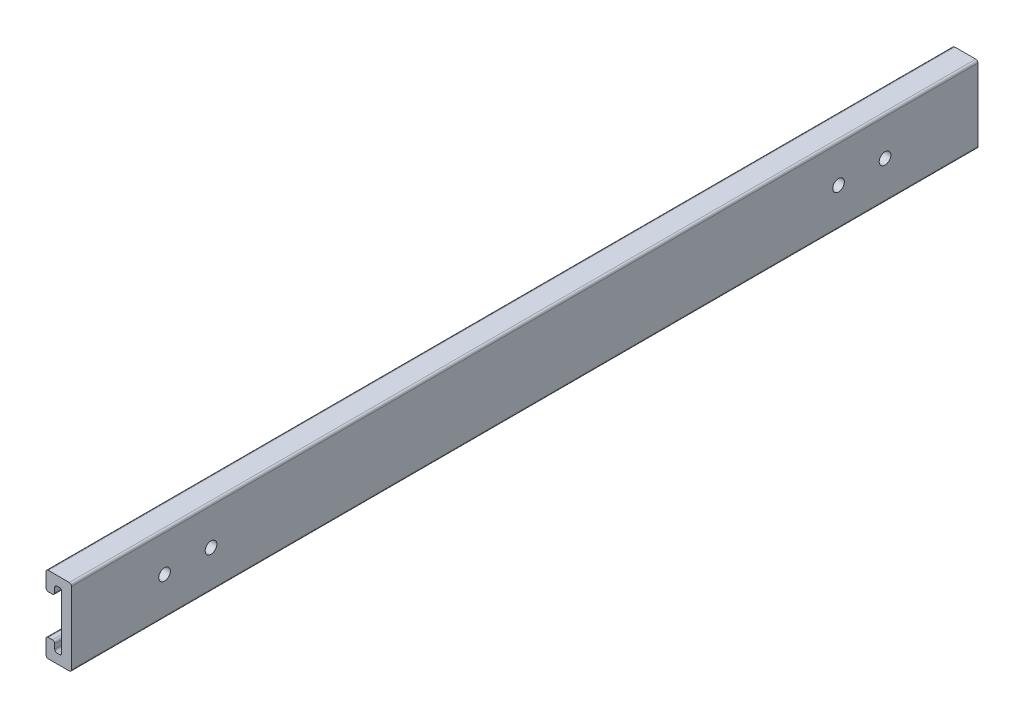
ISO-10303-21;
HEADER;
FILE_DESCRIPTION(('STEP AP214'),'2;1');
FILE_NAME('part.step','',(''),(''),'','','');
FILE_SCHEMA(('AUTOMOTIVE_DESIGN { 1 0 10303 214 1 1 1 1 }'));
ENDSEC;
DATA;
#1=APPLICATION_CONTEXT('core data for automotive mechanical design processes');
#2=APPLICATION_PROTOCOL_DEFINITION('international standard','automotive_design',2000,#1);
#3=PRODUCT_CONTEXT('',#1,'mechanical');
#4=PRODUCT('Part','Part','',(#3));
#5=PRODUCT_RELATED_PRODUCT_CATEGORY('part','',(#4));
#6=PRODUCT_DEFINITION_FORMATION('','',#4);
#7=PRODUCT_DEFINITION_CONTEXT('part definition',#1,'design');
#8=PRODUCT_DEFINITION('design','',#6,#7);
#9=PRODUCT_DEFINITION_SHAPE('','',#8);
#10=(LENGTH_UNIT() NAMED_UNIT(*) SI_UNIT(.MILLI.,.METRE.));
#11=(NAMED_UNIT(*) PLANE_ANGLE_UNIT() SI_UNIT($,.RADIAN.));
#12=(NAMED_UNIT(*) SI_UNIT($,.STERADIAN.) SOLID_ANGLE_UNIT());
#13=UNCERTAINTY_MEASURE_WITH_UNIT(LENGTH_MEASURE(1.E-05),#10,'distance_accuracy_value','');
#14=(GEOMETRIC_REPRESENTATION_CONTEXT(3) GLOBAL_UNCERTAINTY_ASSIGNED_CONTEXT((#13)) GLOBAL_UNIT_ASSIGNED_CONTEXT((#10,
#11,#12)) REPRESENTATION_CONTEXT('',''));
#15=CARTESIAN_POINT('',(0.,0.,0.));
#16=DIRECTION('',(0.,0.,1.));
#17=DIRECTION('',(1.,0.,0.));
#18=AXIS2_PLACEMENT_3D('',#15,#16,#17);
#19=CARTESIAN_POINT('',(4.5,15.5,195.));
#20=DIRECTION('',(0.,0.,-1.));
#21=DIRECTION('',(-1.,0.,0.));
#22=AXIS2_PLACEMENT_3D('',#19,#20,#21);
#23=CYLINDRICAL_SURFACE('',#22,1.);
#24=CARTESIAN_POINT('',(4.5,15.5,-195.));
#25=DIRECTION('',(0.,0.,1.));
#26=DIRECTION('',(1.,0.,0.));
#27=AXIS2_PLACEMENT_3D('',#24,#25,#26);
#28=CIRCLE('',#27,1.);
#29=CARTESIAN_POINT('',(5.5,15.5,-195.));
#30=VERTEX_POINT('',#29);
#31=CARTESIAN_POINT('',(4.49999999999999,16.5,-195.));
#32=VERTEX_POINT('',#31);
#33=EDGE_CURVE('E226',#30,#32,#28,.T.);
#34=ORIENTED_EDGE('',*,*,#33,.T.);
#35=DIRECTION('',(0.,0.,-1.));
#36=VECTOR('',#35,1.);
#37=CARTESIAN_POINT('',(4.49999999999999,16.5,195.));
#38=LINE('',#37,#36);
#39=CARTESIAN_POINT('',(4.49999999999999,16.5,195.));
#40=VERTEX_POINT('',#39);
#41=EDGE_CURVE('E11',#40,#32,#38,.T.);
#42=ORIENTED_EDGE('',*,*,#41,.F.);
#43=CARTESIAN_POINT('',(4.5,15.5,195.));
#44=DIRECTION('',(0.,0.,1.));
#45=DIRECTION('',(1.,0.,0.));
#46=AXIS2_PLACEMENT_3D('',#43,#44,#45);
#47=CIRCLE('',#46,1.);
#48=CARTESIAN_POINT('',(5.5,15.5,195.));
#49=VERTEX_POINT('',#48);
#50=EDGE_CURVE('E273',#49,#40,#47,.T.);
#51=ORIENTED_EDGE('',*,*,#50,.F.);
#52=DIRECTION('',(0.,0.,-1.));
#53=VECTOR('',#52,1.);
#54=CARTESIAN_POINT('',(5.5,15.5,195.));
#55=LINE('',#54,#53);
#56=EDGE_CURVE('E222',#49,#30,#55,.T.);
#57=ORIENTED_EDGE('',*,*,#56,.T.);
#58=EDGE_LOOP('',(#34,#42,#51,#57));
#59=FACE_BOUND('',#58,.T.);
#60=ADVANCED_FACE('F34',(#59),#23,.T.);
#61=CARTESIAN_POINT('',(4.49999999999999,16.5,195.));
#62=DIRECTION('',(0.,-1.,0.));
#63=DIRECTION('',(1.,0.,0.));
#64=AXIS2_PLACEMENT_3D('',#61,#62,#63);
#65=PLANE('',#64);
#66=DIRECTION('',(-1.,0.,0.));
#67=VECTOR('',#66,1.);
#68=CARTESIAN_POINT('',(4.49999999999999,16.5,-195.));
#69=LINE('',#68,#67);
#70=CARTESIAN_POINT('',(-4.49999999999999,16.5,-195.));
#71=VERTEX_POINT('',#70);
#72=EDGE_CURVE('E229',#32,#71,#69,.T.);
#73=ORIENTED_EDGE('',*,*,#72,.T.);
#74=DIRECTION('',(0.,0.,-1.));
#75=VECTOR('',#74,1.);
#76=CARTESIAN_POINT('',(-4.49999999999999,16.5,195.));
#77=LINE('',#76,#75);
#78=CARTESIAN_POINT('',(-4.49999999999999,16.5,195.));
#79=VERTEX_POINT('',#78);
#80=EDGE_CURVE('E42',#79,#71,#77,.T.);
#81=ORIENTED_EDGE('',*,*,#80,.F.);
#82=DIRECTION('',(-1.,0.,0.));
#83=VECTOR('',#82,1.);
#84=CARTESIAN_POINT('',(4.49999999999999,16.5,195.));
#85=LINE('',#84,#83);
#86=EDGE_CURVE('E141',#40,#79,#85,.T.);
#87=ORIENTED_EDGE('',*,*,#86,.F.);
#88=ORIENTED_EDGE('',*,*,#41,.T.);
#89=EDGE_LOOP('',(#73,#81,#87,#88));
#90=FACE_BOUND('',#89,.T.);
#91=ADVANCED_FACE('F414',(#90),#65,.F.);
#92=CARTESIAN_POINT('',(-4.5,15.5,195.));
#93=DIRECTION('',(0.,0.,-1.));
#94=DIRECTION('',(-1.,0.,0.));
#95=AXIS2_PLACEMENT_3D('',#92,#93,#94);
#96=CYLINDRICAL_SURFACE('',#95,1.);
#97=CARTESIAN_POINT('',(-4.5,15.5,-195.));
#98=DIRECTION('',(0.,0.,1.));
#99=DIRECTION('',(1.,0.,0.));
#100=AXIS2_PLACEMENT_3D('',#97,#98,#99);
#101=CIRCLE('',#100,1.);
#102=CARTESIAN_POINT('',(-5.5,15.5,-195.));
#103=VERTEX_POINT('',#102);
#104=EDGE_CURVE('E232',#71,#103,#101,.T.);
#105=ORIENTED_EDGE('',*,*,#104,.T.);
#106=DIRECTION('',(0.,0.,-1.));
#107=VECTOR('',#106,1.);
#108=CARTESIAN_POINT('',(-5.5,15.5,195.));
#109=LINE('',#108,#107);
#110=CARTESIAN_POINT('',(-5.5,15.5,195.));
#111=VERTEX_POINT('',#110);
#112=EDGE_CURVE('E328',#111,#103,#109,.T.);
#113=ORIENTED_EDGE('',*,*,#112,.F.);
#114=CARTESIAN_POINT('',(-4.5,15.5,195.));
#115=DIRECTION('',(0.,0.,1.));
#116=DIRECTION('',(1.,0.,0.));
#117=AXIS2_PLACEMENT_3D('',#114,#115,#116);
#118=CIRCLE('',#117,1.);
#119=EDGE_CURVE('E336',#79,#111,#118,.T.);
#120=ORIENTED_EDGE('',*,*,#119,.F.);
#121=ORIENTED_EDGE('',*,*,#80,.T.);
#122=EDGE_LOOP('',(#105,#113,#120,#121));
#123=FACE_BOUND('',#122,.T.);
#124=ADVANCED_FACE('F334',(#123),#96,.T.);
#125=CARTESIAN_POINT('',(-5.5,15.5,195.));
#126=DIRECTION('',(1.,0.,0.));
#127=DIRECTION('',(0.,1.,0.));
#128=AXIS2_PLACEMENT_3D('',#125,#126,#127);
#129=PLANE('',#128);
#130=DIRECTION('',(0.,-1.,0.));
#131=VECTOR('',#130,1.);
#132=CARTESIAN_POINT('',(-5.5,15.5,-195.));
#133=LINE('',#132,#131);
#134=CARTESIAN_POINT('',(-5.5,9.50000000000001,-195.));
#135=VERTEX_POINT('',#134);
#136=EDGE_CURVE('E234',#103,#135,#133,.T.);
#137=ORIENTED_EDGE('',*,*,#136,.T.);
#138=DIRECTION('',(0.,0.,-1.));
#139=VECTOR('',#138,1.);
#140=CARTESIAN_POINT('',(-5.5,9.50000000000001,195.));
#141=LINE('',#140,#139);
#142=CARTESIAN_POINT('',(-5.5,9.50000000000001,195.));
#143=VERTEX_POINT('',#142);
#144=EDGE_CURVE('E325',#143,#135,#141,.T.);
#145=ORIENTED_EDGE('',*,*,#144,.F.);
#146=DIRECTION('',(0.,-1.,0.));
#147=VECTOR('',#146,1.);
#148=CARTESIAN_POINT('',(-5.5,15.5,195.));
#149=LINE('',#148,#147);
#150=EDGE_CURVE('E354',#111,#143,#149,.T.);
#151=ORIENTED_EDGE('',*,*,#150,.F.);
#152=ORIENTED_EDGE('',*,*,#112,.T.);
#153=EDGE_LOOP('',(#137,#145,#151,#152));
#154=FACE_BOUND('',#153,.T.);
#155=ADVANCED_FACE('F345',(#154),#129,.F.);
#156=CARTESIAN_POINT('',(-4.5,9.5,195.));
#157=DIRECTION('',(0.,0.,-1.));
#158=DIRECTION('',(-1.,0.,0.));
#159=AXIS2_PLACEMENT_3D('',#156,#157,#158);
#160=CYLINDRICAL_SURFACE('',#159,1.);
#161=CARTESIAN_POINT('',(-4.5,9.5,-195.));
#162=DIRECTION('',(0.,0.,1.));
#163=DIRECTION('',(1.,0.,0.));
#164=AXIS2_PLACEMENT_3D('',#161,#162,#163);
#165=CIRCLE('',#164,1.);
#166=CARTESIAN_POINT('',(-4.49999999999999,8.5,-195.));
#167=VERTEX_POINT('',#166);
#168=EDGE_CURVE('E236',#135,#167,#165,.T.);
#169=ORIENTED_EDGE('',*,*,#168,.T.);
#170=DIRECTION('',(0.,0.,-1.));
#171=VECTOR('',#170,1.);
#172=CARTESIAN_POINT('',(-4.49999999999999,8.5,195.));
#173=LINE('',#172,#171);
#174=CARTESIAN_POINT('',(-4.49999999999999,8.5,195.));
#175=VERTEX_POINT('',#174);
#176=EDGE_CURVE('E322',#175,#167,#173,.T.);
#177=ORIENTED_EDGE('',*,*,#176,.F.);
#178=CARTESIAN_POINT('',(-4.5,9.5,195.));
#179=DIRECTION('',(0.,0.,1.));
#180=DIRECTION('',(1.,0.,0.));
#181=AXIS2_PLACEMENT_3D('',#178,#179,#180);
#182=CIRCLE('',#181,1.);
#183=EDGE_CURVE('E351',#143,#175,#182,.T.);
#184=ORIENTED_EDGE('',*,*,#183,.F.);
#185=ORIENTED_EDGE('',*,*,#144,.T.);
#186=EDGE_LOOP('',(#169,#177,#184,#185));
#187=FACE_BOUND('',#186,.T.);
#188=ADVANCED_FACE('F349',(#187),#160,.T.);
#189=CARTESIAN_POINT('',(-4.49999999999999,8.5,195.));
#190=DIRECTION('',(0.,1.,0.));
#191=DIRECTION('',(0.,0.,1.));
#192=AXIS2_PLACEMENT_3D('',#189,#190,#191);
#193=PLANE('',#192);
#194=DIRECTION('',(1.,0.,0.));
#195=VECTOR('',#194,1.);
#196=CARTESIAN_POINT('',(-4.49999999999999,8.5,-195.));
#197=LINE('',#196,#195);
#198=CARTESIAN_POINT('',(-2.75000000000001,8.5,-195.));
#199=VERTEX_POINT('',#198);
#200=EDGE_CURVE('E238',#167,#199,#197,.T.);
#201=ORIENTED_EDGE('',*,*,#200,.T.);
#202=DIRECTION('',(0.,0.,-1.));
#203=VECTOR('',#202,1.);
#204=CARTESIAN_POINT('',(-2.75000000000001,8.5,195.));
#205=LINE('',#204,#203);
#206=CARTESIAN_POINT('',(-2.75000000000001,8.5,195.));
#207=VERTEX_POINT('',#206);
#208=EDGE_CURVE('E319',#207,#199,#205,.T.);
#209=ORIENTED_EDGE('',*,*,#208,.F.);
#210=DIRECTION('',(1.,0.,0.));
#211=VECTOR('',#210,1.);
#212=CARTESIAN_POINT('',(-4.49999999999999,8.5,195.));
#213=LINE('',#212,#211);
#214=EDGE_CURVE('E353',#175,#207,#213,.T.);
#215=ORIENTED_EDGE('',*,*,#214,.F.);
#216=ORIENTED_EDGE('',*,*,#176,.T.);
#217=EDGE_LOOP('',(#201,#209,#215,#216));
#218=FACE_BOUND('',#217,.T.);
#219=ADVANCED_FACE('F427',(#218),#193,.F.);
#220=CARTESIAN_POINT('',(-2.75,9.5,195.));
#221=DIRECTION('',(0.,0.,-1.));
#222=DIRECTION('',(-1.,0.,0.));
#223=AXIS2_PLACEMENT_3D('',#220,#221,#222);
#224=CYLINDRICAL_SURFACE('',#223,1.);
#225=CARTESIAN_POINT('',(-2.75,9.5,-195.));
#226=DIRECTION('',(0.,0.,1.));
#227=DIRECTION('',(1.,0.,0.));
#228=AXIS2_PLACEMENT_3D('',#225,#226,#227);
#229=CIRCLE('',#228,1.);
#230=CARTESIAN_POINT('',(-1.75,9.50000000000001,-195.));
#231=VERTEX_POINT('',#230);
#232=EDGE_CURVE('E240',#199,#231,#229,.T.);
#233=ORIENTED_EDGE('',*,*,#232,.T.);
#234=DIRECTION('',(0.,0.,-1.));
#235=VECTOR('',#234,1.);
#236=CARTESIAN_POINT('',(-1.75,9.50000000000001,195.));
#237=LINE('',#236,#235);
#238=CARTESIAN_POINT('',(-1.75,9.50000000000001,195.));
#239=VERTEX_POINT('',#238);
#240=EDGE_CURVE('E316',#239,#231,#237,.T.);
#241=ORIENTED_EDGE('',*,*,#240,.F.);
#242=CARTESIAN_POINT('',(-2.75,9.5,195.));
#243=DIRECTION('',(0.,0.,1.));
#244=DIRECTION('',(1.,0.,0.));
#245=AXIS2_PLACEMENT_3D('',#242,#243,#244);
#246=CIRCLE('',#245,1.);
#247=EDGE_CURVE('E356',#207,#239,#246,.T.);
#248=ORIENTED_EDGE('',*,*,#247,.F.);
#249=ORIENTED_EDGE('',*,*,#208,.T.);
#250=EDGE_LOOP('',(#233,#241,#248,#249));
#251=FACE_BOUND('',#250,.T.);
#252=ADVANCED_FACE('F430',(#251),#224,.T.);
#253=CARTESIAN_POINT('',(-1.75,9.50000000000001,195.));
#254=DIRECTION('',(-1.,0.,0.));
#255=DIRECTION('',(0.,0.,1.));
#256=AXIS2_PLACEMENT_3D('',#253,#254,#255);
#257=PLANE('',#256);
#258=DIRECTION('',(0.,1.,0.));
#259=VECTOR('',#258,1.);
#260=CARTESIAN_POINT('',(-1.75,9.50000000000001,-195.));
#261=LINE('',#260,#259);
#262=CARTESIAN_POINT('',(-1.75,11.5,-195.));
#263=VERTEX_POINT('',#262);
#264=EDGE_CURVE('E242',#231,#263,#261,.T.);
#265=ORIENTED_EDGE('',*,*,#264,.T.);
#266=DIRECTION('',(0.,0.,-1.));
#267=VECTOR('',#266,1.);
#268=CARTESIAN_POINT('',(-1.75,11.5,195.));
#269=LINE('',#268,#267);
#270=CARTESIAN_POINT('',(-1.75,11.5,195.));
#271=VERTEX_POINT('',#270);
#272=EDGE_CURVE('E313',#271,#263,#269,.T.);
#273=ORIENTED_EDGE('',*,*,#272,.F.);
#274=DIRECTION('',(0.,1.,0.));
#275=VECTOR('',#274,1.);
#276=CARTESIAN_POINT('',(-1.75,9.50000000000001,195.));
#277=LINE('',#276,#275);
#278=EDGE_CURVE('E362',#239,#271,#277,.T.);
#279=ORIENTED_EDGE('',*,*,#278,.F.);
#280=ORIENTED_EDGE('',*,*,#240,.T.);
#281=EDGE_LOOP('',(#265,#273,#279,#280));
#282=FACE_BOUND('',#281,.T.);
#283=ADVANCED_FACE('F434',(#282),#257,.F.);
#284=CARTESIAN_POINT('',(-0.750000000000001,11.5,195.));
#285=DIRECTION('',(0.,0.,-1.));
#286=DIRECTION('',(-1.,0.,0.));
#287=AXIS2_PLACEMENT_3D('',#284,#285,#286);
#288=CYLINDRICAL_SURFACE('',#287,1.);
#289=CARTESIAN_POINT('',(-0.750000000000001,11.5,-195.));
#290=DIRECTION('',(0.,0.,-1.));
#291=DIRECTION('',(-1.,0.,0.));
#292=AXIS2_PLACEMENT_3D('',#289,#290,#291);
#293=CIRCLE('',#292,1.);
#294=CARTESIAN_POINT('',(-0.749999999999993,12.5,-195.));
#295=VERTEX_POINT('',#294);
#296=EDGE_CURVE('E244',#263,#295,#293,.T.);
#297=ORIENTED_EDGE('',*,*,#296,.T.);
#298=DIRECTION('',(0.,0.,-1.));
#299=VECTOR('',#298,1.);
#300=CARTESIAN_POINT('',(-0.749999999999993,12.5,195.));
#301=LINE('',#300,#299);
#302=CARTESIAN_POINT('',(-0.749999999999993,12.5,195.));
#303=VERTEX_POINT('',#302);
#304=EDGE_CURVE('E310',#303,#295,#301,.T.);
#305=ORIENTED_EDGE('',*,*,#304,.F.);
#306=CARTESIAN_POINT('',(-0.750000000000001,11.5,195.));
#307=DIRECTION('',(0.,0.,-1.));
#308=DIRECTION('',(-1.,0.,0.));
#309=AXIS2_PLACEMENT_3D('',#306,#307,#308);
#310=CIRCLE('',#309,1.);
#311=EDGE_CURVE('E364',#271,#303,#310,.T.);
#312=ORIENTED_EDGE('',*,*,#311,.F.);
#313=ORIENTED_EDGE('',*,*,#272,.T.);
#314=EDGE_LOOP('',(#297,#305,#312,#313));
#315=FACE_BOUND('',#314,.T.);
#316=ADVANCED_FACE('F438',(#315),#288,.F.);
#317=CARTESIAN_POINT('',(-0.749999999999993,12.5,195.));
#318=DIRECTION('',(0.,1.,0.));
#319=DIRECTION('',(0.,0.,1.));
#320=AXIS2_PLACEMENT_3D('',#317,#318,#319);
#321=PLANE('',#320);
#322=DIRECTION('',(1.,0.,0.));
#323=VECTOR('',#322,1.);
#324=CARTESIAN_POINT('',(-0.749999999999993,12.5,-195.));
#325=LINE('',#324,#323);
#326=CARTESIAN_POINT('',(0.249999999999993,12.5,-195.));
#327=VERTEX_POINT('',#326);
#328=EDGE_CURVE('E246',#295,#327,#325,.T.);
#329=ORIENTED_EDGE('',*,*,#328,.T.);
#330=DIRECTION('',(0.,0.,-1.));
#331=VECTOR('',#330,1.);
#332=CARTESIAN_POINT('',(0.249999999999993,12.5,195.));
#333=LINE('',#332,#331);
#334=CARTESIAN_POINT('',(0.249999999999993,12.5,195.));
#335=VERTEX_POINT('',#334);
#336=EDGE_CURVE('E307',#335,#327,#333,.T.);
#337=ORIENTED_EDGE('',*,*,#336,.F.);
#338=DIRECTION('',(1.,0.,0.));
#339=VECTOR('',#338,1.);
#340=CARTESIAN_POINT('',(-0.749999999999993,12.5,195.));
#341=LINE('',#340,#339);
#342=EDGE_CURVE('E366',#303,#335,#341,.T.);
#343=ORIENTED_EDGE('',*,*,#342,.F.);
#344=ORIENTED_EDGE('',*,*,#304,.T.);
#345=EDGE_LOOP('',(#329,#337,#343,#344));
#346=FACE_BOUND('',#345,.T.);
#347=ADVANCED_FACE('F442',(#346),#321,.F.);
#348=CARTESIAN_POINT('',(0.249999999999999,11.5,195.));
#349=DIRECTION('',(0.,0.,-1.));
#350=DIRECTION('',(-1.,0.,0.));
#351=AXIS2_PLACEMENT_3D('',#348,#349,#350);
#352=CYLINDRICAL_SURFACE('',#351,1.);
#353=CARTESIAN_POINT('',(0.249999999999999,11.5,-195.));
#354=DIRECTION('',(0.,0.,-1.));
#355=DIRECTION('',(-1.,0.,0.));
#356=AXIS2_PLACEMENT_3D('',#353,#354,#355);
#357=CIRCLE('',#356,1.);
#358=CARTESIAN_POINT('',(1.25,11.5,-195.));
#359=VERTEX_POINT('',#358);
#360=EDGE_CURVE('E248',#327,#359,#357,.T.);
#361=ORIENTED_EDGE('',*,*,#360,.T.);
#362=DIRECTION('',(0.,0.,-1.));
#363=VECTOR('',#362,1.);
#364=CARTESIAN_POINT('',(1.25,11.5,195.));
#365=LINE('',#364,#363);
#366=CARTESIAN_POINT('',(1.25,11.5,195.));
#367=VERTEX_POINT('',#366);
#368=EDGE_CURVE('E304',#367,#359,#365,.T.);
#369=ORIENTED_EDGE('',*,*,#368,.F.);
#370=CARTESIAN_POINT('',(0.249999999999999,11.5,195.));
#371=DIRECTION('',(0.,0.,-1.));
#372=DIRECTION('',(-1.,0.,0.));
#373=AXIS2_PLACEMENT_3D('',#370,#371,#372);
#374=CIRCLE('',#373,1.);
#375=EDGE_CURVE('E368',#335,#367,#374,.T.);
#376=ORIENTED_EDGE('',*,*,#375,.F.);
#377=ORIENTED_EDGE('',*,*,#336,.T.);
#378=EDGE_LOOP('',(#361,#369,#376,#377));
#379=FACE_BOUND('',#378,.T.);
#380=ADVANCED_FACE('F446',(#379),#352,.F.);
#381=CARTESIAN_POINT('',(1.25,11.5,195.));
#382=DIRECTION('',(1.,0.,0.));
#383=DIRECTION('',(0.,0.,-1.));
#384=AXIS2_PLACEMENT_3D('',#381,#382,#383);
#385=PLANE('',#384);
#386=CARTESIAN_POINT('',(1.25,0.,135.));
#387=DIRECTION('',(-1.,0.,0.));
#388=DIRECTION('',(0.,0.,1.));
#389=AXIS2_PLACEMENT_3D('',#386,#387,#388);
#390=CIRCLE('',#389,2.5);
#391=CARTESIAN_POINT('',(1.25,0.,137.5));
#392=VERTEX_POINT('',#391);
#393=EDGE_CURVE('E568',#392,#392,#390,.T.);
#394=ORIENTED_EDGE('',*,*,#393,.F.);
#395=EDGE_LOOP('',(#394));
#396=FACE_BOUND('',#395,.T.);
#397=CARTESIAN_POINT('',(1.25,0.,-135.));
#398=DIRECTION('',(-1.,0.,0.));
#399=DIRECTION('',(0.,0.,-1.));
#400=AXIS2_PLACEMENT_3D('',#397,#398,#399);
#401=CIRCLE('',#400,2.5);
#402=CARTESIAN_POINT('',(1.25,0.,-137.5));
#403=VERTEX_POINT('',#402);
#404=EDGE_CURVE('E578',#403,#403,#401,.T.);
#405=ORIENTED_EDGE('',*,*,#404,.F.);
#406=EDGE_LOOP('',(#405));
#407=FACE_BOUND('',#406,.T.);
#408=CARTESIAN_POINT('',(1.25,0.,-155.));
#409=DIRECTION('',(-1.,0.,0.));
#410=DIRECTION('',(0.,0.,-1.));
#411=AXIS2_PLACEMENT_3D('',#408,#409,#410);
#412=CIRCLE('',#411,2.5);
#413=CARTESIAN_POINT('',(1.25,0.,-157.5));
#414=VERTEX_POINT('',#413);
#415=EDGE_CURVE('E584',#414,#414,#412,.T.);
#416=ORIENTED_EDGE('',*,*,#415,.F.);
#417=EDGE_LOOP('',(#416));
#418=FACE_BOUND('',#417,.T.);
#419=CARTESIAN_POINT('',(1.25,0.,155.));
#420=DIRECTION('',(-1.,0.,0.));
#421=DIRECTION('',(0.,0.,1.));
#422=AXIS2_PLACEMENT_3D('',#419,#420,#421);
#423=CIRCLE('',#422,2.5);
#424=CARTESIAN_POINT('',(1.25,0.,157.5));
#425=VERTEX_POINT('',#424);
#426=EDGE_CURVE('E571',#425,#425,#423,.T.);
#427=ORIENTED_EDGE('',*,*,#426,.F.);
#428=EDGE_LOOP('',(#427));
#429=FACE_BOUND('',#428,.T.);
#430=DIRECTION('',(0.,-1.,0.));
#431=VECTOR('',#430,1.);
#432=CARTESIAN_POINT('',(1.25,11.5,-195.));
#433=LINE('',#432,#431);
#434=CARTESIAN_POINT('',(1.25,-11.5,-195.));
#435=VERTEX_POINT('',#434);
#436=EDGE_CURVE('E250',#359,#435,#433,.T.);
#437=ORIENTED_EDGE('',*,*,#436,.T.);
#438=DIRECTION('',(0.,0.,-1.));
#439=VECTOR('',#438,1.);
#440=CARTESIAN_POINT('',(1.25,-11.5,195.));
#441=LINE('',#440,#439);
#442=CARTESIAN_POINT('',(1.25,-11.5,195.));
#443=VERTEX_POINT('',#442);
#444=EDGE_CURVE('E301',#443,#435,#441,.T.);
#445=ORIENTED_EDGE('',*,*,#444,.F.);
#446=DIRECTION('',(0.,-1.,0.));
#447=VECTOR('',#446,1.);
#448=CARTESIAN_POINT('',(1.25,11.5,195.));
#449=LINE('',#448,#447);
#450=EDGE_CURVE('E370',#367,#443,#449,.T.);
#451=ORIENTED_EDGE('',*,*,#450,.F.);
#452=ORIENTED_EDGE('',*,*,#368,.T.);
#453=EDGE_LOOP('',(#437,#445,#451,#452));
#454=FACE_BOUND('',#453,.T.);
#455=ADVANCED_FACE('F450',(#396,#407,#418,#429,#454),#385,.F.);
#456=CARTESIAN_POINT('',(0.249999999999999,-11.5,195.));
#457=DIRECTION('',(0.,0.,-1.));
#458=DIRECTION('',(-1.,0.,0.));
#459=AXIS2_PLACEMENT_3D('',#456,#457,#458);
#460=CYLINDRICAL_SURFACE('',#459,1.);
#461=CARTESIAN_POINT('',(0.249999999999999,-11.5,-195.));
#462=DIRECTION('',(0.,0.,-1.));
#463=DIRECTION('',(1.,0.,0.));
#464=AXIS2_PLACEMENT_3D('',#461,#462,#463);
#465=CIRCLE('',#464,1.);
#466=CARTESIAN_POINT('',(0.249999999999993,-12.5,-195.));
#467=VERTEX_POINT('',#466);
#468=EDGE_CURVE('E252',#435,#467,#465,.T.);
#469=ORIENTED_EDGE('',*,*,#468,.T.);
#470=DIRECTION('',(0.,0.,-1.));
#471=VECTOR('',#470,1.);
#472=CARTESIAN_POINT('',(0.249999999999993,-12.5,195.));
#473=LINE('',#472,#471);
#474=CARTESIAN_POINT('',(0.249999999999993,-12.5,195.));
#475=VERTEX_POINT('',#474);
#476=EDGE_CURVE('E298',#475,#467,#473,.T.);
#477=ORIENTED_EDGE('',*,*,#476,.F.);
#478=CARTESIAN_POINT('',(0.249999999999999,-11.5,195.));
#479=DIRECTION('',(0.,0.,-1.));
#480=DIRECTION('',(1.,0.,0.));
#481=AXIS2_PLACEMENT_3D('',#478,#479,#480);
#482=CIRCLE('',#481,1.);
#483=EDGE_CURVE('E372',#443,#475,#482,.T.);
#484=ORIENTED_EDGE('',*,*,#483,.F.);
#485=ORIENTED_EDGE('',*,*,#444,.T.);
#486=EDGE_LOOP('',(#469,#477,#484,#485));
#487=FACE_BOUND('',#486,.T.);
#488=ADVANCED_FACE('F454',(#487),#460,.F.);
#489=CARTESIAN_POINT('',(-0.749999999999993,-12.5,195.));
#490=DIRECTION('',(0.,-1.,0.));
#491=DIRECTION('',(0.,0.,-1.));
#492=AXIS2_PLACEMENT_3D('',#489,#490,#491);
#493=PLANE('',#492);
#494=DIRECTION('',(-1.,0.,0.));
#495=VECTOR('',#494,1.);
#496=CARTESIAN_POINT('',(-0.749999999999993,-12.5,-195.));
#497=LINE('',#496,#495);
#498=CARTESIAN_POINT('',(-0.749999999999993,-12.5,-195.));
#499=VERTEX_POINT('',#498);
#500=EDGE_CURVE('E254',#467,#499,#497,.T.);
#501=ORIENTED_EDGE('',*,*,#500,.T.);
#502=DIRECTION('',(0.,0.,-1.));
#503=VECTOR('',#502,1.);
#504=CARTESIAN_POINT('',(-0.749999999999993,-12.5,195.));
#505=LINE('',#504,#503);
#506=CARTESIAN_POINT('',(-0.749999999999993,-12.5,195.));
#507=VERTEX_POINT('',#506);
#508=EDGE_CURVE('E295',#507,#499,#505,.T.);
#509=ORIENTED_EDGE('',*,*,#508,.F.);
#510=DIRECTION('',(-1.,0.,0.));
#511=VECTOR('',#510,1.);
#512=CARTESIAN_POINT('',(-0.749999999999993,-12.5,195.));
#513=LINE('',#512,#511);
#514=EDGE_CURVE('E374',#475,#507,#513,.T.);
#515=ORIENTED_EDGE('',*,*,#514,.F.);
#516=ORIENTED_EDGE('',*,*,#476,.T.);
#517=EDGE_LOOP('',(#501,#509,#515,#516));
#518=FACE_BOUND('',#517,.T.);
#519=ADVANCED_FACE('F458',(#518),#493,.F.);
#520=CARTESIAN_POINT('',(-0.750000000000001,-11.5,195.));
#521=DIRECTION('',(0.,0.,-1.));
#522=DIRECTION('',(-1.,0.,0.));
#523=AXIS2_PLACEMENT_3D('',#520,#521,#522);
#524=CYLINDRICAL_SURFACE('',#523,1.);
#525=CARTESIAN_POINT('',(-0.750000000000001,-11.5,-195.));
#526=DIRECTION('',(0.,0.,-1.));
#527=DIRECTION('',(1.,0.,0.));
#528=AXIS2_PLACEMENT_3D('',#525,#526,#527);
#529=CIRCLE('',#528,1.);
#530=CARTESIAN_POINT('',(-1.75,-11.5,-195.));
#531=VERTEX_POINT('',#530);
#532=EDGE_CURVE('E256',#499,#531,#529,.T.);
#533=ORIENTED_EDGE('',*,*,#532,.T.);
#534=DIRECTION('',(0.,0.,-1.));
#535=VECTOR('',#534,1.);
#536=CARTESIAN_POINT('',(-1.75,-11.5,195.));
#537=LINE('',#536,#535);
#538=CARTESIAN_POINT('',(-1.75,-11.5,195.));
#539=VERTEX_POINT('',#538);
#540=EDGE_CURVE('E292',#539,#531,#537,.T.);
#541=ORIENTED_EDGE('',*,*,#540,.F.);
#542=CARTESIAN_POINT('',(-0.750000000000001,-11.5,195.));
#543=DIRECTION('',(0.,0.,-1.));
#544=DIRECTION('',(1.,0.,0.));
#545=AXIS2_PLACEMENT_3D('',#542,#543,#544);
#546=CIRCLE('',#545,1.);
#547=EDGE_CURVE('E376',#507,#539,#546,.T.);
#548=ORIENTED_EDGE('',*,*,#547,.F.);
#549=ORIENTED_EDGE('',*,*,#508,.T.);
#550=EDGE_LOOP('',(#533,#541,#548,#549));
#551=FACE_BOUND('',#550,.T.);
#552=ADVANCED_FACE('F462',(#551),#524,.F.);
#553=CARTESIAN_POINT('',(-1.75,-9.50000000000001,195.));
#554=DIRECTION('',(-1.,0.,0.));
#555=DIRECTION('',(0.,0.,1.));
#556=AXIS2_PLACEMENT_3D('',#553,#554,#555);
#557=PLANE('',#556);
#558=DIRECTION('',(0.,1.,0.));
#559=VECTOR('',#558,1.);
#560=CARTESIAN_POINT('',(-1.75,-9.50000000000001,-195.));
#561=LINE('',#560,#559);
#562=CARTESIAN_POINT('',(-1.75,-9.50000000000001,-195.));
#563=VERTEX_POINT('',#562);
#564=EDGE_CURVE('E258',#531,#563,#561,.T.);
#565=ORIENTED_EDGE('',*,*,#564,.T.);
#566=DIRECTION('',(0.,0.,-1.));
#567=VECTOR('',#566,1.);
#568=CARTESIAN_POINT('',(-1.75,-9.50000000000001,195.));
#569=LINE('',#568,#567);
#570=CARTESIAN_POINT('',(-1.75,-9.50000000000001,195.));
#571=VERTEX_POINT('',#570);
#572=EDGE_CURVE('E289',#571,#563,#569,.T.);
#573=ORIENTED_EDGE('',*,*,#572,.F.);
#574=DIRECTION('',(0.,1.,0.));
#575=VECTOR('',#574,1.);
#576=CARTESIAN_POINT('',(-1.75,-9.50000000000001,195.));
#577=LINE('',#576,#575);
#578=EDGE_CURVE('E378',#539,#571,#577,.T.);
#579=ORIENTED_EDGE('',*,*,#578,.F.);
#580=ORIENTED_EDGE('',*,*,#540,.T.);
#581=EDGE_LOOP('',(#565,#573,#579,#580));
#582=FACE_BOUND('',#581,.T.);
#583=ADVANCED_FACE('F466',(#582),#557,.F.);
#584=CARTESIAN_POINT('',(-2.75,-9.5,195.));
#585=DIRECTION('',(0.,0.,-1.));
#586=DIRECTION('',(-1.,0.,0.));
#587=AXIS2_PLACEMENT_3D('',#584,#585,#586);
#588=CYLINDRICAL_SURFACE('',#587,1.);
#589=CARTESIAN_POINT('',(-2.75,-9.5,-195.));
#590=DIRECTION('',(0.,0.,1.));
#591=DIRECTION('',(-1.,0.,0.));
#592=AXIS2_PLACEMENT_3D('',#589,#590,#591);
#593=CIRCLE('',#592,1.);
#594=CARTESIAN_POINT('',(-2.75000000000001,-8.5,-195.));
#595=VERTEX_POINT('',#594);
#596=EDGE_CURVE('E260',#563,#595,#593,.T.);
#597=ORIENTED_EDGE('',*,*,#596,.T.);
#598=DIRECTION('',(0.,0.,-1.));
#599=VECTOR('',#598,1.);
#600=CARTESIAN_POINT('',(-2.75000000000001,-8.5,195.));
#601=LINE('',#600,#599);
#602=CARTESIAN_POINT('',(-2.75000000000001,-8.5,195.));
#603=VERTEX_POINT('',#602);
#604=EDGE_CURVE('E286',#603,#595,#601,.T.);
#605=ORIENTED_EDGE('',*,*,#604,.F.);
#606=CARTESIAN_POINT('',(-2.75,-9.5,195.));
#607=DIRECTION('',(0.,0.,1.));
#608=DIRECTION('',(-1.,0.,0.));
#609=AXIS2_PLACEMENT_3D('',#606,#607,#608);
#610=CIRCLE('',#609,1.);
#611=EDGE_CURVE('E380',#571,#603,#610,.T.);
#612=ORIENTED_EDGE('',*,*,#611,.F.);
#613=ORIENTED_EDGE('',*,*,#572,.T.);
#614=EDGE_LOOP('',(#597,#605,#612,#613));
#615=FACE_BOUND('',#614,.T.);
#616=ADVANCED_FACE('F470',(#615),#588,.T.);
#617=CARTESIAN_POINT('',(-4.49999999999999,-8.5,195.));
#618=DIRECTION('',(0.,-1.,0.));
#619=DIRECTION('',(0.,0.,-1.));
#620=AXIS2_PLACEMENT_3D('',#617,#618,#619);
#621=PLANE('',#620);
#622=DIRECTION('',(-1.,0.,0.));
#623=VECTOR('',#622,1.);
#624=CARTESIAN_POINT('',(-4.49999999999999,-8.5,-195.));
#625=LINE('',#624,#623);
#626=CARTESIAN_POINT('',(-4.49999999999999,-8.5,-195.));
#627=VERTEX_POINT('',#626);
#628=EDGE_CURVE('E262',#595,#627,#625,.T.);
#629=ORIENTED_EDGE('',*,*,#628,.T.);
#630=DIRECTION('',(0.,0.,-1.));
#631=VECTOR('',#630,1.);
#632=CARTESIAN_POINT('',(-4.49999999999999,-8.5,195.));
#633=LINE('',#632,#631);
#634=CARTESIAN_POINT('',(-4.49999999999999,-8.5,195.));
#635=VERTEX_POINT('',#634);
#636=EDGE_CURVE('E283',#635,#627,#633,.T.);
#637=ORIENTED_EDGE('',*,*,#636,.F.);
#638=DIRECTION('',(-1.,0.,0.));
#639=VECTOR('',#638,1.);
#640=CARTESIAN_POINT('',(-4.49999999999999,-8.5,195.));
#641=LINE('',#640,#639);
#642=EDGE_CURVE('E382',#603,#635,#641,.T.);
#643=ORIENTED_EDGE('',*,*,#642,.F.);
#644=ORIENTED_EDGE('',*,*,#604,.T.);
#645=EDGE_LOOP('',(#629,#637,#643,#644));
#646=FACE_BOUND('',#645,.T.);
#647=ADVANCED_FACE('F474',(#646),#621,.F.);
#648=CARTESIAN_POINT('',(-4.5,-9.5,195.));
#649=DIRECTION('',(0.,0.,-1.));
#650=DIRECTION('',(-1.,0.,0.));
#651=AXIS2_PLACEMENT_3D('',#648,#649,#650);
#652=CYLINDRICAL_SURFACE('',#651,1.);
#653=CARTESIAN_POINT('',(-4.5,-9.5,-195.));
#654=DIRECTION('',(0.,0.,1.));
#655=DIRECTION('',(-1.,0.,0.));
#656=AXIS2_PLACEMENT_3D('',#653,#654,#655);
#657=CIRCLE('',#656,1.);
#658=CARTESIAN_POINT('',(-5.5,-9.50000000000001,-195.));
#659=VERTEX_POINT('',#658);
#660=EDGE_CURVE('E264',#627,#659,#657,.T.);
#661=ORIENTED_EDGE('',*,*,#660,.T.);
#662=DIRECTION('',(0.,0.,-1.));
#663=VECTOR('',#662,1.);
#664=CARTESIAN_POINT('',(-5.5,-9.50000000000001,195.));
#665=LINE('',#664,#663);
#666=CARTESIAN_POINT('',(-5.5,-9.50000000000001,195.));
#667=VERTEX_POINT('',#666);
#668=EDGE_CURVE('E280',#667,#659,#665,.T.);
#669=ORIENTED_EDGE('',*,*,#668,.F.);
#670=CARTESIAN_POINT('',(-4.5,-9.5,195.));
#671=DIRECTION('',(0.,0.,1.));
#672=DIRECTION('',(-1.,0.,0.));
#673=AXIS2_PLACEMENT_3D('',#670,#671,#672);
#674=CIRCLE('',#673,1.);
#675=EDGE_CURVE('E384',#635,#667,#674,.T.);
#676=ORIENTED_EDGE('',*,*,#675,.F.);
#677=ORIENTED_EDGE('',*,*,#636,.T.);
#678=EDGE_LOOP('',(#661,#669,#676,#677));
#679=FACE_BOUND('',#678,.T.);
#680=ADVANCED_FACE('F478',(#679),#652,.T.);
#681=CARTESIAN_POINT('',(-5.5,-15.5,195.));
#682=DIRECTION('',(1.,0.,0.));
#683=DIRECTION('',(0.,1.,0.));
#684=AXIS2_PLACEMENT_3D('',#681,#682,#683);
#685=PLANE('',#684);
#686=DIRECTION('',(0.,-1.,0.));
#687=VECTOR('',#686,1.);
#688=CARTESIAN_POINT('',(-5.5,-15.5,-195.));
#689=LINE('',#688,#687);
#690=CARTESIAN_POINT('',(-5.5,-15.5,-195.));
#691=VERTEX_POINT('',#690);
#692=EDGE_CURVE('E266',#659,#691,#689,.T.);
#693=ORIENTED_EDGE('',*,*,#692,.T.);
#694=DIRECTION('',(0.,0.,-1.));
#695=VECTOR('',#694,1.);
#696=CARTESIAN_POINT('',(-5.5,-15.5,195.));
#697=LINE('',#696,#695);
#698=CARTESIAN_POINT('',(-5.5,-15.5,195.));
#699=VERTEX_POINT('',#698);
#700=EDGE_CURVE('E277',#699,#691,#697,.T.);
#701=ORIENTED_EDGE('',*,*,#700,.F.);
#702=DIRECTION('',(0.,-1.,0.));
#703=VECTOR('',#702,1.);
#704=CARTESIAN_POINT('',(-5.5,-15.5,195.));
#705=LINE('',#704,#703);
#706=EDGE_CURVE('E386',#667,#699,#705,.T.);
#707=ORIENTED_EDGE('',*,*,#706,.F.);
#708=ORIENTED_EDGE('',*,*,#668,.T.);
#709=EDGE_LOOP('',(#693,#701,#707,#708));
#710=FACE_BOUND('',#709,.T.);
#711=ADVANCED_FACE('F392',(#710),#685,.F.);
#712=CARTESIAN_POINT('',(-4.5,-15.5,195.));
#713=DIRECTION('',(0.,0.,-1.));
#714=DIRECTION('',(-1.,0.,0.));
#715=AXIS2_PLACEMENT_3D('',#712,#713,#714);
#716=CYLINDRICAL_SURFACE('',#715,1.);
#717=CARTESIAN_POINT('',(-4.5,-15.5,-195.));
#718=DIRECTION('',(0.,0.,1.));
#719=DIRECTION('',(-1.,0.,0.));
#720=AXIS2_PLACEMENT_3D('',#717,#718,#719);
#721=CIRCLE('',#720,1.);
#722=CARTESIAN_POINT('',(-4.49999999999999,-16.5,-195.));
#723=VERTEX_POINT('',#722);
#724=EDGE_CURVE('E268',#691,#723,#721,.T.);
#725=ORIENTED_EDGE('',*,*,#724,.T.);
#726=DIRECTION('',(0.,0.,-1.));
#727=VECTOR('',#726,1.);
#728=CARTESIAN_POINT('',(-4.49999999999999,-16.5,195.));
#729=LINE('',#728,#727);
#730=CARTESIAN_POINT('',(-4.49999999999999,-16.5,195.));
#731=VERTEX_POINT('',#730);
#732=EDGE_CURVE('E217',#731,#723,#729,.T.);
#733=ORIENTED_EDGE('',*,*,#732,.F.);
#734=CARTESIAN_POINT('',(-4.5,-15.5,195.));
#735=DIRECTION('',(0.,0.,1.));
#736=DIRECTION('',(-1.,0.,0.));
#737=AXIS2_PLACEMENT_3D('',#734,#735,#736);
#738=CIRCLE('',#737,1.);
#739=EDGE_CURVE('E208',#699,#731,#738,.T.);
#740=ORIENTED_EDGE('',*,*,#739,.F.);
#741=ORIENTED_EDGE('',*,*,#700,.T.);
#742=EDGE_LOOP('',(#725,#733,#740,#741));
#743=FACE_BOUND('',#742,.T.);
#744=ADVANCED_FACE('F396',(#743),#716,.T.);
#745=CARTESIAN_POINT('',(4.49999999999999,-16.5,195.));
#746=DIRECTION('',(0.,1.,0.));
#747=DIRECTION('',(-1.,0.,0.));
#748=AXIS2_PLACEMENT_3D('',#745,#746,#747);
#749=PLANE('',#748);
#750=DIRECTION('',(1.,0.,0.));
#751=VECTOR('',#750,1.);
#752=CARTESIAN_POINT('',(4.49999999999999,-16.5,-195.));
#753=LINE('',#752,#751);
#754=CARTESIAN_POINT('',(4.49999999999999,-16.5,-195.));
#755=VERTEX_POINT('',#754);
#756=EDGE_CURVE('E216',#723,#755,#753,.T.);
#757=ORIENTED_EDGE('',*,*,#756,.T.);
#758=DIRECTION('',(0.,0.,-1.));
#759=VECTOR('',#758,1.);
#760=CARTESIAN_POINT('',(4.49999999999999,-16.5,195.));
#761=LINE('',#760,#759);
#762=CARTESIAN_POINT('',(4.49999999999999,-16.5,195.));
#763=VERTEX_POINT('',#762);
#764=EDGE_CURVE('E213',#763,#755,#761,.T.);
#765=ORIENTED_EDGE('',*,*,#764,.F.);
#766=DIRECTION('',(1.,0.,0.));
#767=VECTOR('',#766,1.);
#768=CARTESIAN_POINT('',(4.49999999999999,-16.5,195.));
#769=LINE('',#768,#767);
#770=EDGE_CURVE('E202',#731,#763,#769,.T.);
#771=ORIENTED_EDGE('',*,*,#770,.F.);
#772=ORIENTED_EDGE('',*,*,#732,.T.);
#773=EDGE_LOOP('',(#757,#765,#771,#772));
#774=FACE_BOUND('',#773,.T.);
#775=ADVANCED_FACE('F214',(#774),#749,.F.);
#776=CARTESIAN_POINT('',(4.5,-15.5,195.));
#777=DIRECTION('',(0.,0.,-1.));
#778=DIRECTION('',(-1.,0.,0.));
#779=AXIS2_PLACEMENT_3D('',#776,#777,#778);
#780=CYLINDRICAL_SURFACE('',#779,1.);
#781=CARTESIAN_POINT('',(4.5,-15.5,-195.));
#782=DIRECTION('',(0.,0.,1.));
#783=DIRECTION('',(-1.,0.,0.));
#784=AXIS2_PLACEMENT_3D('',#781,#782,#783);
#785=CIRCLE('',#784,1.);
#786=CARTESIAN_POINT('',(5.5,-15.5,-195.));
#787=VERTEX_POINT('',#786);
#788=EDGE_CURVE('E127',#755,#787,#785,.T.);
#789=ORIENTED_EDGE('',*,*,#788,.T.);
#790=DIRECTION('',(0.,0.,-1.));
#791=VECTOR('',#790,1.);
#792=CARTESIAN_POINT('',(5.5,-15.5,195.));
#793=LINE('',#792,#791);
#794=CARTESIAN_POINT('',(5.5,-15.5,195.));
#795=VERTEX_POINT('',#794);
#796=EDGE_CURVE('E218',#795,#787,#793,.T.);
#797=ORIENTED_EDGE('',*,*,#796,.F.);
#798=CARTESIAN_POINT('',(4.5,-15.5,195.));
#799=DIRECTION('',(0.,0.,1.));
#800=DIRECTION('',(-1.,0.,0.));
#801=AXIS2_PLACEMENT_3D('',#798,#799,#800);
#802=CIRCLE('',#801,1.);
#803=EDGE_CURVE('E206',#763,#795,#802,.T.);
#804=ORIENTED_EDGE('',*,*,#803,.F.);
#805=ORIENTED_EDGE('',*,*,#764,.T.);
#806=EDGE_LOOP('',(#789,#797,#804,#805));
#807=FACE_BOUND('',#806,.T.);
#808=ADVANCED_FACE('F220',(#807),#780,.T.);
#809=CARTESIAN_POINT('',(5.5,-15.5,195.));
#810=DIRECTION('',(-1.,0.,0.));
#811=DIRECTION('',(0.,0.,1.));
#812=AXIS2_PLACEMENT_3D('',#809,#810,#811);
#813=PLANE('',#812);
#814=CARTESIAN_POINT('',(5.5,0.,135.));
#815=DIRECTION('',(-1.,0.,0.));
#816=DIRECTION('',(0.,0.,1.));
#817=AXIS2_PLACEMENT_3D('',#814,#815,#816);
#818=CIRCLE('',#817,2.5);
#819=CARTESIAN_POINT('',(5.5,0.,137.5));
#820=VERTEX_POINT('',#819);
#821=EDGE_CURVE('E570',#820,#820,#818,.F.);
#822=ORIENTED_EDGE('',*,*,#821,.F.);
#823=EDGE_LOOP('',(#822));
#824=FACE_BOUND('',#823,.T.);
#825=CARTESIAN_POINT('',(5.5,0.,-135.));
#826=DIRECTION('',(-1.,0.,0.));
#827=DIRECTION('',(0.,0.,1.));
#828=AXIS2_PLACEMENT_3D('',#825,#826,#827);
#829=CIRCLE('',#828,2.5);
#830=CARTESIAN_POINT('',(5.5,0.,-132.5));
#831=VERTEX_POINT('',#830);
#832=EDGE_CURVE('E575',#831,#831,#829,.F.);
#833=ORIENTED_EDGE('',*,*,#832,.F.);
#834=EDGE_LOOP('',(#833));
#835=FACE_BOUND('',#834,.T.);
#836=CARTESIAN_POINT('',(5.5,0.,-155.));
#837=DIRECTION('',(-1.,0.,0.));
#838=DIRECTION('',(0.,0.,1.));
#839=AXIS2_PLACEMENT_3D('',#836,#837,#838);
#840=CIRCLE('',#839,2.5);
#841=CARTESIAN_POINT('',(5.5,0.,-152.5));
#842=VERTEX_POINT('',#841);
#843=EDGE_CURVE('E581',#842,#842,#840,.F.);
#844=ORIENTED_EDGE('',*,*,#843,.F.);
#845=EDGE_LOOP('',(#844));
#846=FACE_BOUND('',#845,.T.);
#847=CARTESIAN_POINT('',(5.5,0.,155.));
#848=DIRECTION('',(-1.,0.,0.));
#849=DIRECTION('',(0.,0.,1.));
#850=AXIS2_PLACEMENT_3D('',#847,#848,#849);
#851=CIRCLE('',#850,2.5);
#852=CARTESIAN_POINT('',(5.5,0.,157.5));
#853=VERTEX_POINT('',#852);
#854=EDGE_CURVE('E230',#853,#853,#851,.F.);
#855=ORIENTED_EDGE('',*,*,#854,.F.);
#856=EDGE_LOOP('',(#855));
#857=FACE_BOUND('',#856,.T.);
#858=DIRECTION('',(0.,1.,0.));
#859=VECTOR('',#858,1.);
#860=CARTESIAN_POINT('',(5.5,-15.5,-195.));
#861=LINE('',#860,#859);
#862=EDGE_CURVE('E133',#787,#30,#861,.T.);
#863=ORIENTED_EDGE('',*,*,#862,.T.);
#864=ORIENTED_EDGE('',*,*,#56,.F.);
#865=DIRECTION('',(0.,1.,0.));
#866=VECTOR('',#865,1.);
#867=CARTESIAN_POINT('',(5.5,-15.5,195.));
#868=LINE('',#867,#866);
#869=EDGE_CURVE('E50',#795,#49,#868,.T.);
#870=ORIENTED_EDGE('',*,*,#869,.F.);
#871=ORIENTED_EDGE('',*,*,#796,.T.);
#872=EDGE_LOOP('',(#863,#864,#870,#871));
#873=FACE_BOUND('',#872,.T.);
#874=ADVANCED_FACE('F400',(#824,#835,#846,#857,#873),#813,.F.);
#875=CARTESIAN_POINT('',(4.5,15.5,195.));
#876=DIRECTION('',(0.,0.,1.));
#877=DIRECTION('',(1.,0.,0.));
#878=AXIS2_PLACEMENT_3D('',#875,#876,#877);
#879=PLANE('',#878);
#880=ORIENTED_EDGE('',*,*,#50,.T.);
#881=ORIENTED_EDGE('',*,*,#86,.T.);
#882=ORIENTED_EDGE('',*,*,#119,.T.);
#883=ORIENTED_EDGE('',*,*,#150,.T.);
#884=ORIENTED_EDGE('',*,*,#183,.T.);
#885=ORIENTED_EDGE('',*,*,#214,.T.);
#886=ORIENTED_EDGE('',*,*,#247,.T.);
#887=ORIENTED_EDGE('',*,*,#278,.T.);
#888=ORIENTED_EDGE('',*,*,#311,.T.);
#889=ORIENTED_EDGE('',*,*,#342,.T.);
#890=ORIENTED_EDGE('',*,*,#375,.T.);
#891=ORIENTED_EDGE('',*,*,#450,.T.);
#892=ORIENTED_EDGE('',*,*,#483,.T.);
#893=ORIENTED_EDGE('',*,*,#514,.T.);
#894=ORIENTED_EDGE('',*,*,#547,.T.);
#895=ORIENTED_EDGE('',*,*,#578,.T.);
#896=ORIENTED_EDGE('',*,*,#611,.T.);
#897=ORIENTED_EDGE('',*,*,#642,.T.);
#898=ORIENTED_EDGE('',*,*,#675,.T.);
#899=ORIENTED_EDGE('',*,*,#706,.T.);
#900=ORIENTED_EDGE('',*,*,#739,.T.);
#901=ORIENTED_EDGE('',*,*,#770,.T.);
#902=ORIENTED_EDGE('',*,*,#803,.T.);
#903=ORIENTED_EDGE('',*,*,#869,.T.);
#904=EDGE_LOOP('',(#880,#881,#882,#883,#884,#885,#886,#887,#888,#889,#890,#891,#892,#893,#894,
#895,#896,#897,#898,#899,#900,#901,#902,#903));
#905=FACE_BOUND('',#904,.T.);
#906=ADVANCED_FACE('F204',(#905),#879,.T.);
#907=CARTESIAN_POINT('',(4.5,15.5,-195.));
#908=DIRECTION('',(0.,0.,1.));
#909=DIRECTION('',(1.,0.,0.));
#910=AXIS2_PLACEMENT_3D('',#907,#908,#909);
#911=PLANE('',#910);
#912=ORIENTED_EDGE('',*,*,#33,.F.);
#913=ORIENTED_EDGE('',*,*,#862,.F.);
#914=ORIENTED_EDGE('',*,*,#788,.F.);
#915=ORIENTED_EDGE('',*,*,#756,.F.);
#916=ORIENTED_EDGE('',*,*,#724,.F.);
#917=ORIENTED_EDGE('',*,*,#692,.F.);
#918=ORIENTED_EDGE('',*,*,#660,.F.);
#919=ORIENTED_EDGE('',*,*,#628,.F.);
#920=ORIENTED_EDGE('',*,*,#596,.F.);
#921=ORIENTED_EDGE('',*,*,#564,.F.);
#922=ORIENTED_EDGE('',*,*,#532,.F.);
#923=ORIENTED_EDGE('',*,*,#500,.F.);
#924=ORIENTED_EDGE('',*,*,#468,.F.);
#925=ORIENTED_EDGE('',*,*,#436,.F.);
#926=ORIENTED_EDGE('',*,*,#360,.F.);
#927=ORIENTED_EDGE('',*,*,#328,.F.);
#928=ORIENTED_EDGE('',*,*,#296,.F.);
#929=ORIENTED_EDGE('',*,*,#264,.F.);
#930=ORIENTED_EDGE('',*,*,#232,.F.);
#931=ORIENTED_EDGE('',*,*,#200,.F.);
#932=ORIENTED_EDGE('',*,*,#168,.F.);
#933=ORIENTED_EDGE('',*,*,#136,.F.);
#934=ORIENTED_EDGE('',*,*,#104,.F.);
#935=ORIENTED_EDGE('',*,*,#72,.F.);
#936=EDGE_LOOP('',(#912,#913,#914,#915,#916,#917,#918,#919,#920,#921,#922,#923,#924,#925,#926,
#927,#928,#929,#930,#931,#932,#933,#934,#935));
#937=FACE_BOUND('',#936,.T.);
#938=ADVANCED_FACE('F340',(#937),#911,.F.);
#939=CARTESIAN_POINT('',(5.501,0.,155.));
#940=DIRECTION('',(-1.,0.,0.));
#941=DIRECTION('',(0.,0.,1.));
#942=AXIS2_PLACEMENT_3D('',#939,#940,#941);
#943=CYLINDRICAL_SURFACE('',#942,2.5);
#944=ORIENTED_EDGE('',*,*,#426,.T.);
#945=EDGE_LOOP('',(#944));
#946=FACE_BOUND('',#945,.T.);
#947=ORIENTED_EDGE('',*,*,#854,.T.);
#948=EDGE_LOOP('',(#947));
#949=FACE_BOUND('',#948,.T.);
#950=ADVANCED_FACE('F512',(#946,#949),#943,.F.);
#951=CARTESIAN_POINT('',(5.501,0.,-155.));
#952=DIRECTION('',(-1.,0.,0.));
#953=DIRECTION('',(0.,0.,1.));
#954=AXIS2_PLACEMENT_3D('',#951,#952,#953);
#955=CYLINDRICAL_SURFACE('',#954,2.5);
#956=ORIENTED_EDGE('',*,*,#415,.T.);
#957=EDGE_LOOP('',(#956));
#958=FACE_BOUND('',#957,.T.);
#959=ORIENTED_EDGE('',*,*,#843,.T.);
#960=EDGE_LOOP('',(#959));
#961=FACE_BOUND('',#960,.T.);
#962=ADVANCED_FACE('F531',(#958,#961),#955,.F.);
#963=CARTESIAN_POINT('',(5.501,0.,-135.));
#964=DIRECTION('',(-1.,0.,0.));
#965=DIRECTION('',(0.,0.,1.));
#966=AXIS2_PLACEMENT_3D('',#963,#964,#965);
#967=CYLINDRICAL_SURFACE('',#966,2.5);
#968=ORIENTED_EDGE('',*,*,#404,.T.);
#969=EDGE_LOOP('',(#968));
#970=FACE_BOUND('',#969,.T.);
#971=ORIENTED_EDGE('',*,*,#832,.T.);
#972=EDGE_LOOP('',(#971));
#973=FACE_BOUND('',#972,.T.);
#974=ADVANCED_FACE('F541',(#970,#973),#967,.F.);
#975=CARTESIAN_POINT('',(5.501,0.,135.));
#976=DIRECTION('',(-1.,0.,0.));
#977=DIRECTION('',(0.,0.,1.));
#978=AXIS2_PLACEMENT_3D('',#975,#976,#977);
#979=CYLINDRICAL_SURFACE('',#978,2.5);
#980=ORIENTED_EDGE('',*,*,#393,.T.);
#981=EDGE_LOOP('',(#980));
#982=FACE_BOUND('',#981,.T.);
#983=ORIENTED_EDGE('',*,*,#821,.T.);
#984=EDGE_LOOP('',(#983));
#985=FACE_BOUND('',#984,.T.);
#986=ADVANCED_FACE('F551',(#982,#985),#979,.F.);
#987=CLOSED_SHELL('',(#60,#91,#124,#155,#188,#219,#252,#283,#316,#347,#380,#455,#488,#519,#552,
#583,#616,#647,#680,#711,#744,#775,#808,#874,#906,#938,#950,#962,#974,#986));
#988=MANIFOLD_SOLID_BREP('B2',#987);
#989=ADVANCED_BREP_SHAPE_REPRESENTATION('',(#18,#988),#14);
#990=SHAPE_DEFINITION_REPRESENTATION(#9,#989);
ENDSEC;
END-ISO-10303-21;
